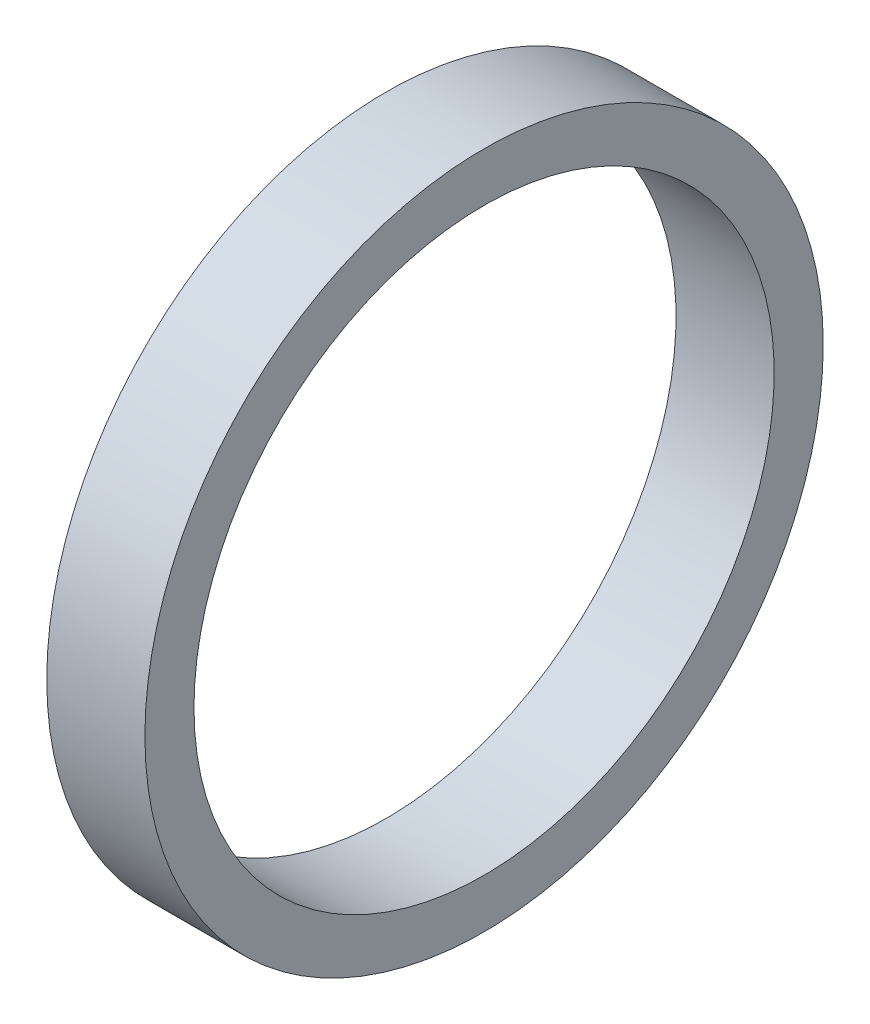
ISO-10303-21;
HEADER;
FILE_DESCRIPTION(('STEP AP214'),'2;1');
FILE_NAME('part.step','',(''),(''),'','','');
FILE_SCHEMA(('AUTOMOTIVE_DESIGN { 1 0 10303 214 1 1 1 1 }'));
ENDSEC;
DATA;
#1=APPLICATION_CONTEXT('core data for automotive mechanical design processes');
#2=APPLICATION_PROTOCOL_DEFINITION('international standard','automotive_design',2000,#1);
#3=PRODUCT_CONTEXT('',#1,'mechanical');
#4=PRODUCT('Part','Part','',(#3));
#5=PRODUCT_RELATED_PRODUCT_CATEGORY('part','',(#4));
#6=PRODUCT_DEFINITION_FORMATION('','',#4);
#7=PRODUCT_DEFINITION_CONTEXT('part definition',#1,'design');
#8=PRODUCT_DEFINITION('design','',#6,#7);
#9=PRODUCT_DEFINITION_SHAPE('','',#8);
#10=(LENGTH_UNIT() NAMED_UNIT(*) SI_UNIT(.MILLI.,.METRE.));
#11=(NAMED_UNIT(*) PLANE_ANGLE_UNIT() SI_UNIT($,.RADIAN.));
#12=(NAMED_UNIT(*) SI_UNIT($,.STERADIAN.) SOLID_ANGLE_UNIT());
#13=UNCERTAINTY_MEASURE_WITH_UNIT(LENGTH_MEASURE(1.E-05),#10,'distance_accuracy_value','');
#14=(GEOMETRIC_REPRESENTATION_CONTEXT(3) GLOBAL_UNCERTAINTY_ASSIGNED_CONTEXT((#13)) GLOBAL_UNIT_ASSIGNED_CONTEXT((#10,
#11,#12)) REPRESENTATION_CONTEXT('',''));
#15=CARTESIAN_POINT('',(0.,0.,0.));
#16=DIRECTION('',(0.,0.,1.));
#17=DIRECTION('',(1.,0.,0.));
#18=AXIS2_PLACEMENT_3D('',#15,#16,#17);
#19=CARTESIAN_POINT('',(-19.0506147540984,23.65,0.));
#20=DIRECTION('',(-1.,0.,0.));
#21=DIRECTION('',(0.,0.,1.));
#22=AXIS2_PLACEMENT_3D('',#19,#20,#21);
#23=PLANE('',#22);
#24=CARTESIAN_POINT('',(-19.0506147540984,0.,0.));
#25=DIRECTION('',(-1.,0.,0.));
#26=DIRECTION('',(0.,0.,1.));
#27=AXIS2_PLACEMENT_3D('',#24,#25,#26);
#28=CIRCLE('',#27,27.65);
#29=CARTESIAN_POINT('',(-19.0506147540984,0.,27.65));
#30=VERTEX_POINT('',#29);
#31=EDGE_CURVE('E10',#30,#30,#28,.T.);
#32=ORIENTED_EDGE('',*,*,#31,.F.);
#33=EDGE_LOOP('',(#32));
#34=FACE_BOUND('',#33,.T.);
#35=CARTESIAN_POINT('',(-19.0506147540984,0.,0.));
#36=DIRECTION('',(-1.,0.,0.));
#37=DIRECTION('',(0.,0.,1.));
#38=AXIS2_PLACEMENT_3D('',#35,#36,#37);
#39=CIRCLE('',#38,23.65);
#40=CARTESIAN_POINT('',(-19.0506147540984,0.,23.65));
#41=VERTEX_POINT('',#40);
#42=EDGE_CURVE('E362',#41,#41,#39,.T.);
#43=ORIENTED_EDGE('',*,*,#42,.T.);
#44=EDGE_LOOP('',(#43));
#45=FACE_BOUND('',#44,.T.);
#46=ADVANCED_FACE('F348',(#34,#45),#23,.F.);
#47=CARTESIAN_POINT('',(-74.1440573770492,0.,0.));
#48=DIRECTION('',(-1.,0.,0.));
#49=DIRECTION('',(0.,0.,1.));
#50=AXIS2_PLACEMENT_3D('',#47,#48,#49);
#51=CYLINDRICAL_SURFACE('',#50,27.65);
#52=CARTESIAN_POINT('',(-27.0506147540984,0.,0.));
#53=DIRECTION('',(-1.,0.,0.));
#54=DIRECTION('',(0.,0.,1.));
#55=AXIS2_PLACEMENT_3D('',#52,#53,#54);
#56=CIRCLE('',#55,27.65);
#57=CARTESIAN_POINT('',(-27.0506147540984,0.,27.65));
#58=VERTEX_POINT('',#57);
#59=EDGE_CURVE('E354',#58,#58,#56,.T.);
#60=ORIENTED_EDGE('',*,*,#59,.F.);
#61=EDGE_LOOP('',(#60));
#62=FACE_BOUND('',#61,.T.);
#63=ORIENTED_EDGE('',*,*,#31,.T.);
#64=EDGE_LOOP('',(#63));
#65=FACE_BOUND('',#64,.T.);
#66=ADVANCED_FACE('F377',(#62,#65),#51,.T.);
#67=CARTESIAN_POINT('',(-27.0506147540984,23.65,0.));
#68=DIRECTION('',(1.,0.,0.));
#69=DIRECTION('',(0.,0.,-1.));
#70=AXIS2_PLACEMENT_3D('',#67,#68,#69);
#71=PLANE('',#70);
#72=CARTESIAN_POINT('',(-27.0506147540984,0.,0.));
#73=DIRECTION('',(-1.,0.,0.));
#74=DIRECTION('',(0.,0.,1.));
#75=AXIS2_PLACEMENT_3D('',#72,#73,#74);
#76=CIRCLE('',#75,23.65);
#77=CARTESIAN_POINT('',(-27.0506147540984,0.,23.65));
#78=VERTEX_POINT('',#77);
#79=EDGE_CURVE('E358',#78,#78,#76,.T.);
#80=ORIENTED_EDGE('',*,*,#79,.F.);
#81=EDGE_LOOP('',(#80));
#82=FACE_BOUND('',#81,.T.);
#83=ORIENTED_EDGE('',*,*,#59,.T.);
#84=EDGE_LOOP('',(#83));
#85=FACE_BOUND('',#84,.T.);
#86=ADVANCED_FACE('F372',(#82,#85),#71,.F.);
#87=CARTESIAN_POINT('',(-74.1440573770492,0.,0.));
#88=DIRECTION('',(-1.,0.,0.));
#89=DIRECTION('',(0.,0.,1.));
#90=AXIS2_PLACEMENT_3D('',#87,#88,#89);
#91=CYLINDRICAL_SURFACE('',#90,23.65);
#92=ORIENTED_EDGE('',*,*,#42,.F.);
#93=EDGE_LOOP('',(#92));
#94=FACE_BOUND('',#93,.T.);
#95=ORIENTED_EDGE('',*,*,#79,.T.);
#96=EDGE_LOOP('',(#95));
#97=FACE_BOUND('',#96,.T.);
#98=ADVANCED_FACE('F369',(#94,#97),#91,.F.);
#99=CLOSED_SHELL('',(#46,#66,#86,#98));
#100=MANIFOLD_SOLID_BREP('B2',#99);
#101=ADVANCED_BREP_SHAPE_REPRESENTATION('',(#18,#100),#14);
#102=SHAPE_DEFINITION_REPRESENTATION(#9,#101);
ENDSEC;
END-ISO-10303-21;
